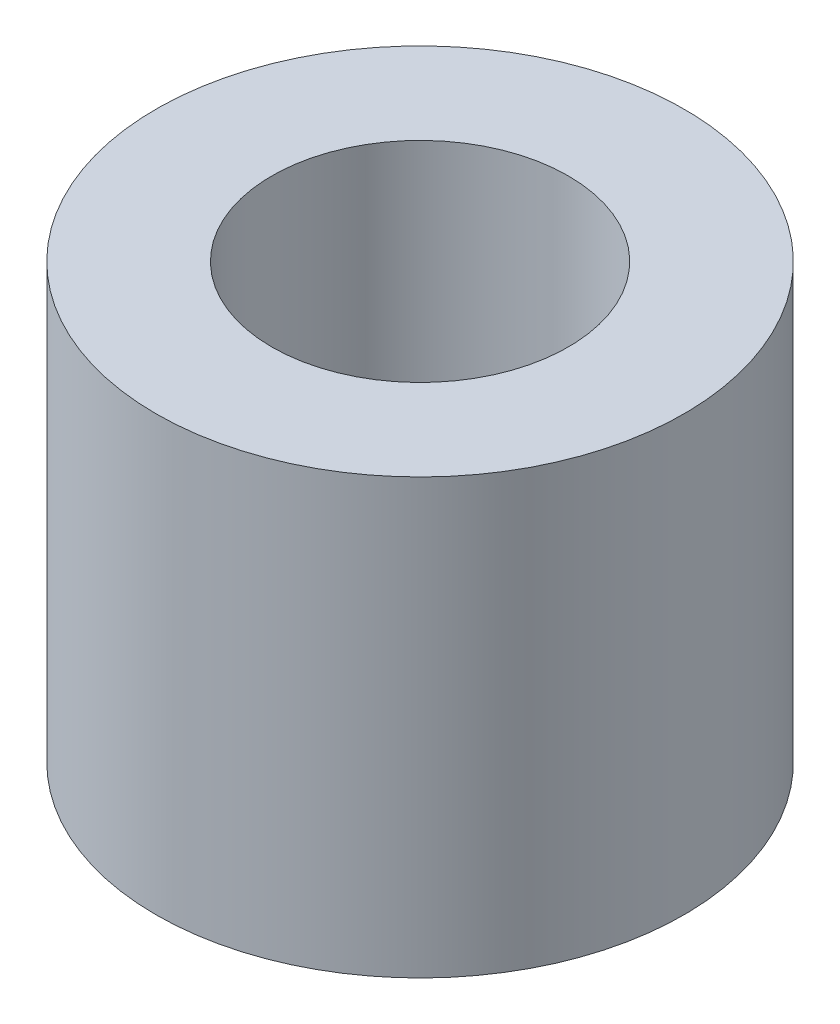
ISO-10303-21;
HEADER;
FILE_DESCRIPTION(('STEP AP214'),'2;1');
FILE_NAME('part.step','',(''),(''),'','','');
FILE_SCHEMA(('AUTOMOTIVE_DESIGN { 1 0 10303 214 1 1 1 1 }'));
ENDSEC;
DATA;
#1=APPLICATION_CONTEXT('core data for automotive mechanical design processes');
#2=APPLICATION_PROTOCOL_DEFINITION('international standard','automotive_design',2000,#1);
#3=PRODUCT_CONTEXT('',#1,'mechanical');
#4=PRODUCT('Part','Part','',(#3));
#5=PRODUCT_RELATED_PRODUCT_CATEGORY('part','',(#4));
#6=PRODUCT_DEFINITION_FORMATION('','',#4);
#7=PRODUCT_DEFINITION_CONTEXT('part definition',#1,'design');
#8=PRODUCT_DEFINITION('design','',#6,#7);
#9=PRODUCT_DEFINITION_SHAPE('','',#8);
#10=(LENGTH_UNIT() NAMED_UNIT(*) SI_UNIT(.MILLI.,.METRE.));
#11=(NAMED_UNIT(*) PLANE_ANGLE_UNIT() SI_UNIT($,.RADIAN.));
#12=(NAMED_UNIT(*) SI_UNIT($,.STERADIAN.) SOLID_ANGLE_UNIT());
#13=UNCERTAINTY_MEASURE_WITH_UNIT(LENGTH_MEASURE(1.E-05),#10,'distance_accuracy_value','');
#14=(GEOMETRIC_REPRESENTATION_CONTEXT(3) GLOBAL_UNCERTAINTY_ASSIGNED_CONTEXT((#13)) GLOBAL_UNIT_ASSIGNED_CONTEXT((#10,
#11,#12)) REPRESENTATION_CONTEXT('',''));
#15=CARTESIAN_POINT('',(0.,0.,0.));
#16=DIRECTION('',(0.,0.,1.));
#17=DIRECTION('',(1.,0.,0.));
#18=AXIS2_PLACEMENT_3D('',#15,#16,#17);
#19=CARTESIAN_POINT('',(0.,3.,0.));
#20=DIRECTION('',(0.,1.,0.));
#21=DIRECTION('',(0.,0.,1.));
#22=AXIS2_PLACEMENT_3D('',#19,#20,#21);
#23=PLANE('',#22);
#24=CARTESIAN_POINT('',(0.,3.,0.));
#25=DIRECTION('',(0.,1.,0.));
#26=DIRECTION('',(0.,0.,1.));
#27=AXIS2_PLACEMENT_3D('',#24,#25,#26);
#28=CIRCLE('',#27,1.825);
#29=CARTESIAN_POINT('',(0.,3.,1.825));
#30=VERTEX_POINT('',#29);
#31=EDGE_CURVE('E10',#30,#30,#28,.T.);
#32=ORIENTED_EDGE('',*,*,#31,.T.);
#33=EDGE_LOOP('',(#32));
#34=FACE_BOUND('',#33,.T.);
#35=CARTESIAN_POINT('',(0.,3.,0.));
#36=DIRECTION('',(0.,1.,0.));
#37=DIRECTION('',(0.,0.,1.));
#38=AXIS2_PLACEMENT_3D('',#35,#36,#37);
#39=CIRCLE('',#38,1.025);
#40=CARTESIAN_POINT('',(0.,3.,1.025));
#41=VERTEX_POINT('',#40);
#42=EDGE_CURVE('E48',#41,#41,#39,.T.);
#43=ORIENTED_EDGE('',*,*,#42,.F.);
#44=EDGE_LOOP('',(#43));
#45=FACE_BOUND('',#44,.T.);
#46=ADVANCED_FACE('F37',(#34,#45),#23,.T.);
#47=CARTESIAN_POINT('',(0.,0.,0.));
#48=DIRECTION('',(0.,1.,0.));
#49=DIRECTION('',(0.,0.,1.));
#50=AXIS2_PLACEMENT_3D('',#47,#48,#49);
#51=PLANE('',#50);
#52=CARTESIAN_POINT('',(0.,0.,0.));
#53=DIRECTION('',(0.,1.,0.));
#54=DIRECTION('',(0.,0.,1.));
#55=AXIS2_PLACEMENT_3D('',#52,#53,#54);
#56=CIRCLE('',#55,1.825);
#57=CARTESIAN_POINT('',(0.,0.,1.825));
#58=VERTEX_POINT('',#57);
#59=EDGE_CURVE('E41',#58,#58,#56,.T.);
#60=ORIENTED_EDGE('',*,*,#59,.F.);
#61=EDGE_LOOP('',(#60));
#62=FACE_BOUND('',#61,.T.);
#63=CARTESIAN_POINT('',(0.,0.,0.));
#64=DIRECTION('',(0.,1.,0.));
#65=DIRECTION('',(0.,0.,1.));
#66=AXIS2_PLACEMENT_3D('',#63,#64,#65);
#67=CIRCLE('',#66,1.025);
#68=CARTESIAN_POINT('',(0.,0.,1.025));
#69=VERTEX_POINT('',#68);
#70=EDGE_CURVE('E50',#69,#69,#67,.T.);
#71=ORIENTED_EDGE('',*,*,#70,.T.);
#72=EDGE_LOOP('',(#71));
#73=FACE_BOUND('',#72,.T.);
#74=ADVANCED_FACE('F60',(#62,#73),#51,.F.);
#75=CARTESIAN_POINT('',(0.,3.,0.));
#76=DIRECTION('',(0.,-1.,0.));
#77=DIRECTION('',(0.,0.,-1.));
#78=AXIS2_PLACEMENT_3D('',#75,#76,#77);
#79=CYLINDRICAL_SURFACE('',#78,1.825);
#80=ORIENTED_EDGE('',*,*,#31,.F.);
#81=EDGE_LOOP('',(#80));
#82=FACE_BOUND('',#81,.T.);
#83=ORIENTED_EDGE('',*,*,#59,.T.);
#84=EDGE_LOOP('',(#83));
#85=FACE_BOUND('',#84,.T.);
#86=ADVANCED_FACE('F39',(#82,#85),#79,.T.);
#87=CARTESIAN_POINT('',(0.,3.,0.));
#88=DIRECTION('',(0.,-1.,0.));
#89=DIRECTION('',(0.,0.,-1.));
#90=AXIS2_PLACEMENT_3D('',#87,#88,#89);
#91=CYLINDRICAL_SURFACE('',#90,1.025);
#92=ORIENTED_EDGE('',*,*,#42,.T.);
#93=EDGE_LOOP('',(#92));
#94=FACE_BOUND('',#93,.T.);
#95=ORIENTED_EDGE('',*,*,#70,.F.);
#96=EDGE_LOOP('',(#95));
#97=FACE_BOUND('',#96,.T.);
#98=ADVANCED_FACE('F56',(#94,#97),#91,.F.);
#99=CLOSED_SHELL('',(#46,#74,#86,#98));
#100=MANIFOLD_SOLID_BREP('B2',#99);
#101=ADVANCED_BREP_SHAPE_REPRESENTATION('',(#18,#100),#14);
#102=SHAPE_DEFINITION_REPRESENTATION(#9,#101);
ENDSEC;
END-ISO-10303-21;
